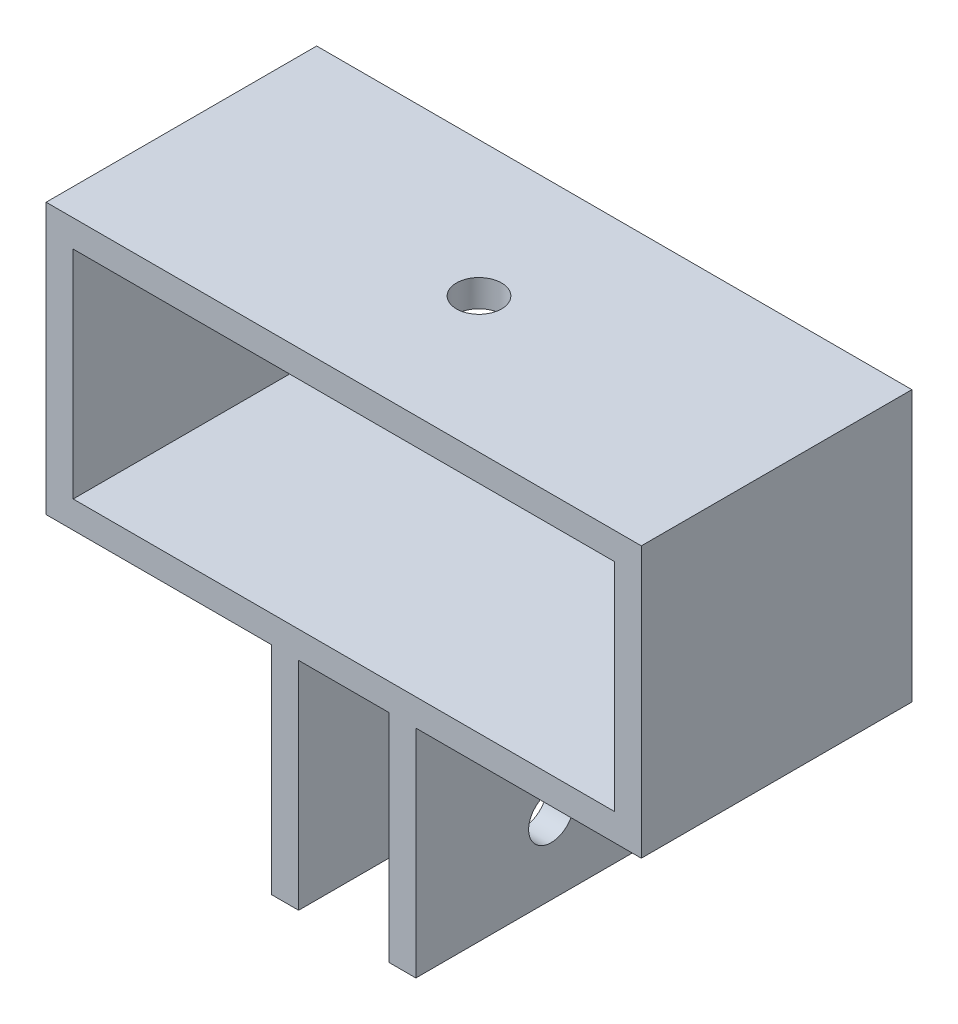
ISO-10303-21;
HEADER;
FILE_DESCRIPTION(('STEP AP214'),'2;1');
FILE_NAME('part.step','',(''),(''),'','','');
FILE_SCHEMA(('AUTOMOTIVE_DESIGN { 1 0 10303 214 1 1 1 1 }'));
ENDSEC;
DATA;
#1=APPLICATION_CONTEXT('core data for automotive mechanical design processes');
#2=APPLICATION_PROTOCOL_DEFINITION('international standard','automotive_design',2000,#1);
#3=PRODUCT_CONTEXT('',#1,'mechanical');
#4=PRODUCT('Part','Part','',(#3));
#5=PRODUCT_RELATED_PRODUCT_CATEGORY('part','',(#4));
#6=PRODUCT_DEFINITION_FORMATION('','',#4);
#7=PRODUCT_DEFINITION_CONTEXT('part definition',#1,'design');
#8=PRODUCT_DEFINITION('design','',#6,#7);
#9=PRODUCT_DEFINITION_SHAPE('','',#8);
#10=(LENGTH_UNIT() NAMED_UNIT(*) SI_UNIT(.MILLI.,.METRE.));
#11=(NAMED_UNIT(*) PLANE_ANGLE_UNIT() SI_UNIT($,.RADIAN.));
#12=(NAMED_UNIT(*) SI_UNIT($,.STERADIAN.) SOLID_ANGLE_UNIT());
#13=UNCERTAINTY_MEASURE_WITH_UNIT(LENGTH_MEASURE(1.E-05),#10,'distance_accuracy_value','');
#14=(GEOMETRIC_REPRESENTATION_CONTEXT(3) GLOBAL_UNCERTAINTY_ASSIGNED_CONTEXT((#13)) GLOBAL_UNIT_ASSIGNED_CONTEXT((#10,
#11,#12)) REPRESENTATION_CONTEXT('',''));
#15=CARTESIAN_POINT('',(0.,0.,0.));
#16=DIRECTION('',(0.,0.,1.));
#17=DIRECTION('',(1.,0.,0.));
#18=AXIS2_PLACEMENT_3D('',#15,#16,#17);
#19=CARTESIAN_POINT('',(-33.,30.,-15.));
#20=DIRECTION('',(0.,0.,1.));
#21=DIRECTION('',(1.,0.,0.));
#22=AXIS2_PLACEMENT_3D('',#19,#20,#21);
#23=PLANE('',#22);
#24=DIRECTION('',(0.,-1.,0.));
#25=VECTOR('',#24,1.);
#26=CARTESIAN_POINT('',(30.,0.,-15.));
#27=LINE('',#26,#25);
#28=CARTESIAN_POINT('',(30.,27.,-15.));
#29=VERTEX_POINT('',#28);
#30=CARTESIAN_POINT('',(30.,3.,-15.));
#31=VERTEX_POINT('',#30);
#32=EDGE_CURVE('E218',#29,#31,#27,.T.);
#33=ORIENTED_EDGE('',*,*,#32,.F.);
#34=DIRECTION('',(1.,0.,0.));
#35=VECTOR('',#34,1.);
#36=CARTESIAN_POINT('',(0.,27.,-15.));
#37=LINE('',#36,#35);
#38=CARTESIAN_POINT('',(-30.,27.,-15.));
#39=VERTEX_POINT('',#38);
#40=EDGE_CURVE('E220',#39,#29,#37,.T.);
#41=ORIENTED_EDGE('',*,*,#40,.F.);
#42=DIRECTION('',(0.,-1.,0.));
#43=VECTOR('',#42,1.);
#44=CARTESIAN_POINT('',(-30.,0.,-15.));
#45=LINE('',#44,#43);
#46=CARTESIAN_POINT('',(-30.,3.,-15.));
#47=VERTEX_POINT('',#46);
#48=EDGE_CURVE('E223',#39,#47,#45,.T.);
#49=ORIENTED_EDGE('',*,*,#48,.T.);
#50=DIRECTION('',(1.,0.,0.));
#51=VECTOR('',#50,1.);
#52=CARTESIAN_POINT('',(0.,3.,-15.));
#53=LINE('',#52,#51);
#54=EDGE_CURVE('E226',#47,#31,#53,.T.);
#55=ORIENTED_EDGE('',*,*,#54,.T.);
#56=EDGE_LOOP('',(#33,#41,#49,#55));
#57=FACE_BOUND('',#56,.T.);
#58=DIRECTION('',(0.,-1.,0.));
#59=VECTOR('',#58,1.);
#60=CARTESIAN_POINT('',(5.,0.,-15.));
#61=LINE('',#60,#59);
#62=CARTESIAN_POINT('',(5.,0.,-15.));
#63=VERTEX_POINT('',#62);
#64=CARTESIAN_POINT('',(5.,-24.,-15.));
#65=VERTEX_POINT('',#64);
#66=EDGE_CURVE('E160',#63,#65,#61,.T.);
#67=ORIENTED_EDGE('',*,*,#66,.F.);
#68=DIRECTION('',(1.,0.,0.));
#69=VECTOR('',#68,1.);
#70=CARTESIAN_POINT('',(-5.,0.,-15.));
#71=LINE('',#70,#69);
#72=CARTESIAN_POINT('',(-5.,0.,-15.));
#73=VERTEX_POINT('',#72);
#74=EDGE_CURVE('E149',#73,#63,#71,.T.);
#75=ORIENTED_EDGE('',*,*,#74,.F.);
#76=DIRECTION('',(0.,-1.,0.));
#77=VECTOR('',#76,1.);
#78=CARTESIAN_POINT('',(-5.,0.,-15.));
#79=LINE('',#78,#77);
#80=CARTESIAN_POINT('',(-5.,-24.,-15.));
#81=VERTEX_POINT('',#80);
#82=EDGE_CURVE('E172',#73,#81,#79,.T.);
#83=ORIENTED_EDGE('',*,*,#82,.T.);
#84=DIRECTION('',(1.,0.,0.));
#85=VECTOR('',#84,1.);
#86=CARTESIAN_POINT('',(-8.,-24.,-15.));
#87=LINE('',#86,#85);
#88=CARTESIAN_POINT('',(-8.,-24.,-15.));
#89=VERTEX_POINT('',#88);
#90=EDGE_CURVE('E196',#89,#81,#87,.T.);
#91=ORIENTED_EDGE('',*,*,#90,.F.);
#92=DIRECTION('',(0.,1.,0.));
#93=VECTOR('',#92,1.);
#94=CARTESIAN_POINT('',(-8.,-24.,-15.));
#95=LINE('',#94,#93);
#96=CARTESIAN_POINT('',(-8.,0.,-15.));
#97=VERTEX_POINT('',#96);
#98=EDGE_CURVE('E205',#89,#97,#95,.T.);
#99=ORIENTED_EDGE('',*,*,#98,.T.);
#100=DIRECTION('',(-1.,0.,0.));
#101=VECTOR('',#100,1.);
#102=CARTESIAN_POINT('',(-33.,0.,-15.));
#103=LINE('',#102,#101);
#104=CARTESIAN_POINT('',(-33.,0.,-15.));
#105=VERTEX_POINT('',#104);
#106=EDGE_CURVE('E263',#97,#105,#103,.T.);
#107=ORIENTED_EDGE('',*,*,#106,.T.);
#108=DIRECTION('',(0.,-1.,0.));
#109=VECTOR('',#108,1.);
#110=CARTESIAN_POINT('',(-33.,30.,-15.));
#111=LINE('',#110,#109);
#112=CARTESIAN_POINT('',(-33.,30.,-15.));
#113=VERTEX_POINT('',#112);
#114=EDGE_CURVE('E43',#113,#105,#111,.T.);
#115=ORIENTED_EDGE('',*,*,#114,.F.);
#116=DIRECTION('',(-1.,0.,0.));
#117=VECTOR('',#116,1.);
#118=CARTESIAN_POINT('',(-33.,30.,-15.));
#119=LINE('',#118,#117);
#120=CARTESIAN_POINT('',(33.,30.,-15.));
#121=VERTEX_POINT('',#120);
#122=EDGE_CURVE('E253',#121,#113,#119,.T.);
#123=ORIENTED_EDGE('',*,*,#122,.F.);
#124=DIRECTION('',(0.,-1.,0.));
#125=VECTOR('',#124,1.);
#126=CARTESIAN_POINT('',(33.,30.,-15.));
#127=LINE('',#126,#125);
#128=CARTESIAN_POINT('',(33.,0.,-15.));
#129=VERTEX_POINT('',#128);
#130=EDGE_CURVE('E11',#121,#129,#127,.T.);
#131=ORIENTED_EDGE('',*,*,#130,.T.);
#132=CARTESIAN_POINT('',(8.,0.,-15.));
#133=VERTEX_POINT('',#132);
#134=EDGE_CURVE('E264',#129,#133,#103,.T.);
#135=ORIENTED_EDGE('',*,*,#134,.T.);
#136=DIRECTION('',(0.,1.,0.));
#137=VECTOR('',#136,1.);
#138=CARTESIAN_POINT('',(8.,-24.,-15.));
#139=LINE('',#138,#137);
#140=CARTESIAN_POINT('',(8.,-24.,-15.));
#141=VERTEX_POINT('',#140);
#142=EDGE_CURVE('E199',#141,#133,#139,.T.);
#143=ORIENTED_EDGE('',*,*,#142,.F.);
#144=EDGE_CURVE('E171',#65,#141,#87,.T.);
#145=ORIENTED_EDGE('',*,*,#144,.F.);
#146=EDGE_LOOP('',(#67,#75,#83,#91,#99,#107,#115,#123,#131,#135,#143,#145));
#147=FACE_BOUND('',#146,.T.);
#148=ADVANCED_FACE('F34',(#57,#147),#23,.F.);
#149=CARTESIAN_POINT('',(-33.,30.,15.));
#150=DIRECTION('',(0.,0.,-1.));
#151=DIRECTION('',(-1.,0.,0.));
#152=AXIS2_PLACEMENT_3D('',#149,#150,#151);
#153=PLANE('',#152);
#154=DIRECTION('',(0.,-1.,0.));
#155=VECTOR('',#154,1.);
#156=CARTESIAN_POINT('',(30.,0.,15.));
#157=LINE('',#156,#155);
#158=CARTESIAN_POINT('',(30.,27.,15.));
#159=VERTEX_POINT('',#158);
#160=CARTESIAN_POINT('',(30.,3.,15.));
#161=VERTEX_POINT('',#160);
#162=EDGE_CURVE('E230',#159,#161,#157,.T.);
#163=ORIENTED_EDGE('',*,*,#162,.T.);
#164=DIRECTION('',(1.,0.,0.));
#165=VECTOR('',#164,1.);
#166=CARTESIAN_POINT('',(0.,3.,15.));
#167=LINE('',#166,#165);
#168=CARTESIAN_POINT('',(-30.,3.,15.));
#169=VERTEX_POINT('',#168);
#170=EDGE_CURVE('E221',#169,#161,#167,.T.);
#171=ORIENTED_EDGE('',*,*,#170,.F.);
#172=DIRECTION('',(0.,-1.,0.));
#173=VECTOR('',#172,1.);
#174=CARTESIAN_POINT('',(-30.,0.,15.));
#175=LINE('',#174,#173);
#176=CARTESIAN_POINT('',(-30.,27.,15.));
#177=VERTEX_POINT('',#176);
#178=EDGE_CURVE('E236',#177,#169,#175,.T.);
#179=ORIENTED_EDGE('',*,*,#178,.F.);
#180=DIRECTION('',(1.,0.,0.));
#181=VECTOR('',#180,1.);
#182=CARTESIAN_POINT('',(0.,27.,15.));
#183=LINE('',#182,#181);
#184=EDGE_CURVE('E233',#177,#159,#183,.T.);
#185=ORIENTED_EDGE('',*,*,#184,.T.);
#186=EDGE_LOOP('',(#163,#171,#179,#185));
#187=FACE_BOUND('',#186,.T.);
#188=DIRECTION('',(0.,-1.,0.));
#189=VECTOR('',#188,1.);
#190=CARTESIAN_POINT('',(5.,0.,15.));
#191=LINE('',#190,#189);
#192=CARTESIAN_POINT('',(5.,0.,15.));
#193=VERTEX_POINT('',#192);
#194=CARTESIAN_POINT('',(5.,-24.,15.));
#195=VERTEX_POINT('',#194);
#196=EDGE_CURVE('E166',#193,#195,#191,.T.);
#197=ORIENTED_EDGE('',*,*,#196,.T.);
#198=DIRECTION('',(-1.,0.,0.));
#199=VECTOR('',#198,1.);
#200=CARTESIAN_POINT('',(-8.,-24.,15.));
#201=LINE('',#200,#199);
#202=CARTESIAN_POINT('',(8.,-24.,15.));
#203=VERTEX_POINT('',#202);
#204=EDGE_CURVE('E191',#203,#195,#201,.T.);
#205=ORIENTED_EDGE('',*,*,#204,.F.);
#206=DIRECTION('',(0.,1.,0.));
#207=VECTOR('',#206,1.);
#208=CARTESIAN_POINT('',(8.,-24.,15.));
#209=LINE('',#208,#207);
#210=CARTESIAN_POINT('',(8.,0.,15.));
#211=VERTEX_POINT('',#210);
#212=EDGE_CURVE('E211',#203,#211,#209,.T.);
#213=ORIENTED_EDGE('',*,*,#212,.T.);
#214=DIRECTION('',(1.,0.,0.));
#215=VECTOR('',#214,1.);
#216=CARTESIAN_POINT('',(-33.,0.,15.));
#217=LINE('',#216,#215);
#218=CARTESIAN_POINT('',(33.,0.,15.));
#219=VERTEX_POINT('',#218);
#220=EDGE_CURVE('E268',#211,#219,#217,.T.);
#221=ORIENTED_EDGE('',*,*,#220,.T.);
#222=DIRECTION('',(0.,-1.,0.));
#223=VECTOR('',#222,1.);
#224=CARTESIAN_POINT('',(33.,30.,15.));
#225=LINE('',#224,#223);
#226=CARTESIAN_POINT('',(33.,30.,15.));
#227=VERTEX_POINT('',#226);
#228=EDGE_CURVE('E260',#227,#219,#225,.T.);
#229=ORIENTED_EDGE('',*,*,#228,.F.);
#230=DIRECTION('',(1.,0.,0.));
#231=VECTOR('',#230,1.);
#232=CARTESIAN_POINT('',(-33.,30.,15.));
#233=LINE('',#232,#231);
#234=CARTESIAN_POINT('',(-33.,30.,15.));
#235=VERTEX_POINT('',#234);
#236=EDGE_CURVE('E258',#235,#227,#233,.T.);
#237=ORIENTED_EDGE('',*,*,#236,.F.);
#238=DIRECTION('',(0.,-1.,0.));
#239=VECTOR('',#238,1.);
#240=CARTESIAN_POINT('',(-33.,30.,15.));
#241=LINE('',#240,#239);
#242=CARTESIAN_POINT('',(-33.,0.,15.));
#243=VERTEX_POINT('',#242);
#244=EDGE_CURVE('E273',#235,#243,#241,.T.);
#245=ORIENTED_EDGE('',*,*,#244,.T.);
#246=CARTESIAN_POINT('',(-8.,0.,15.));
#247=VERTEX_POINT('',#246);
#248=EDGE_CURVE('E254',#243,#247,#217,.T.);
#249=ORIENTED_EDGE('',*,*,#248,.T.);
#250=DIRECTION('',(0.,1.,0.));
#251=VECTOR('',#250,1.);
#252=CARTESIAN_POINT('',(-8.,-24.,15.));
#253=LINE('',#252,#251);
#254=CARTESIAN_POINT('',(-8.,-24.,15.));
#255=VERTEX_POINT('',#254);
#256=EDGE_CURVE('E208',#255,#247,#253,.T.);
#257=ORIENTED_EDGE('',*,*,#256,.F.);
#258=CARTESIAN_POINT('',(-5.,-24.,15.));
#259=VERTEX_POINT('',#258);
#260=EDGE_CURVE('E189',#259,#255,#201,.T.);
#261=ORIENTED_EDGE('',*,*,#260,.F.);
#262=DIRECTION('',(0.,-1.,0.));
#263=VECTOR('',#262,1.);
#264=CARTESIAN_POINT('',(-5.,0.,15.));
#265=LINE('',#264,#263);
#266=CARTESIAN_POINT('',(-5.,0.,15.));
#267=VERTEX_POINT('',#266);
#268=EDGE_CURVE('E51',#267,#259,#265,.T.);
#269=ORIENTED_EDGE('',*,*,#268,.F.);
#270=DIRECTION('',(1.,0.,0.));
#271=VECTOR('',#270,1.);
#272=CARTESIAN_POINT('',(-5.,0.,15.));
#273=LINE('',#272,#271);
#274=EDGE_CURVE('E177',#267,#193,#273,.T.);
#275=ORIENTED_EDGE('',*,*,#274,.T.);
#276=EDGE_LOOP('',(#197,#205,#213,#221,#229,#237,#245,#249,#257,#261,#269,#275));
#277=FACE_BOUND('',#276,.T.);
#278=ADVANCED_FACE('F295',(#187,#277),#153,.F.);
#279=CARTESIAN_POINT('',(0.,-24.,0.));
#280=DIRECTION('',(0.,-1.,0.));
#281=DIRECTION('',(0.,0.,-1.));
#282=AXIS2_PLACEMENT_3D('',#279,#280,#281);
#283=PLANE('',#282);
#284=ORIENTED_EDGE('',*,*,#204,.T.);
#285=DIRECTION('',(0.,0.,1.));
#286=VECTOR('',#285,1.);
#287=CARTESIAN_POINT('',(5.,-24.,-15.));
#288=LINE('',#287,#286);
#289=EDGE_CURVE('E167',#65,#195,#288,.T.);
#290=ORIENTED_EDGE('',*,*,#289,.F.);
#291=ORIENTED_EDGE('',*,*,#144,.T.);
#292=DIRECTION('',(0.,0.,1.));
#293=VECTOR('',#292,1.);
#294=CARTESIAN_POINT('',(8.,-24.,15.));
#295=LINE('',#294,#293);
#296=EDGE_CURVE('E186',#141,#203,#295,.T.);
#297=ORIENTED_EDGE('',*,*,#296,.T.);
#298=EDGE_LOOP('',(#284,#290,#291,#297));
#299=FACE_BOUND('',#298,.T.);
#300=ADVANCED_FACE('F320',(#299),#283,.T.);
#301=CARTESIAN_POINT('',(0.,0.,0.));
#302=DIRECTION('',(0.,1.,0.));
#303=DIRECTION('',(0.,0.,1.));
#304=AXIS2_PLACEMENT_3D('',#301,#302,#303);
#305=PLANE('',#304);
#306=DIRECTION('',(0.,0.,1.));
#307=VECTOR('',#306,1.);
#308=CARTESIAN_POINT('',(8.,0.,15.));
#309=LINE('',#308,#307);
#310=EDGE_CURVE('E59',#133,#211,#309,.T.);
#311=ORIENTED_EDGE('',*,*,#310,.F.);
#312=ORIENTED_EDGE('',*,*,#134,.F.);
#313=DIRECTION('',(0.,0.,-1.));
#314=VECTOR('',#313,1.);
#315=CARTESIAN_POINT('',(33.,0.,-15.));
#316=LINE('',#315,#314);
#317=EDGE_CURVE('E243',#219,#129,#316,.T.);
#318=ORIENTED_EDGE('',*,*,#317,.F.);
#319=ORIENTED_EDGE('',*,*,#220,.F.);
#320=EDGE_LOOP('',(#311,#312,#318,#319));
#321=FACE_BOUND('',#320,.T.);
#322=ADVANCED_FACE('F327',(#321),#305,.F.);
#323=DIRECTION('',(0.,0.,-1.));
#324=VECTOR('',#323,1.);
#325=CARTESIAN_POINT('',(-8.,0.,15.));
#326=LINE('',#325,#324);
#327=EDGE_CURVE('E190',#247,#97,#326,.T.);
#328=ORIENTED_EDGE('',*,*,#327,.F.);
#329=ORIENTED_EDGE('',*,*,#248,.F.);
#330=DIRECTION('',(0.,0.,1.));
#331=VECTOR('',#330,1.);
#332=CARTESIAN_POINT('',(-33.,0.,-15.));
#333=LINE('',#332,#331);
#334=EDGE_CURVE('E266',#105,#243,#333,.T.);
#335=ORIENTED_EDGE('',*,*,#334,.F.);
#336=ORIENTED_EDGE('',*,*,#106,.F.);
#337=EDGE_LOOP('',(#328,#329,#335,#336));
#338=FACE_BOUND('',#337,.T.);
#339=ADVANCED_FACE('F330',(#338),#305,.F.);
#340=CARTESIAN_POINT('',(33.,30.,-15.));
#341=DIRECTION('',(-1.,0.,0.));
#342=DIRECTION('',(0.,0.,1.));
#343=AXIS2_PLACEMENT_3D('',#340,#341,#342);
#344=PLANE('',#343);
#345=ORIENTED_EDGE('',*,*,#317,.T.);
#346=ORIENTED_EDGE('',*,*,#130,.F.);
#347=DIRECTION('',(0.,0.,-1.));
#348=VECTOR('',#347,1.);
#349=CARTESIAN_POINT('',(33.,30.,-15.));
#350=LINE('',#349,#348);
#351=EDGE_CURVE('E250',#227,#121,#350,.T.);
#352=ORIENTED_EDGE('',*,*,#351,.F.);
#353=ORIENTED_EDGE('',*,*,#228,.T.);
#354=EDGE_LOOP('',(#345,#346,#352,#353));
#355=FACE_BOUND('',#354,.T.);
#356=ADVANCED_FACE('F36',(#355),#344,.F.);
#357=CARTESIAN_POINT('',(-33.,30.,-15.));
#358=DIRECTION('',(1.,0.,0.));
#359=DIRECTION('',(0.,0.,-1.));
#360=AXIS2_PLACEMENT_3D('',#357,#358,#359);
#361=PLANE('',#360);
#362=ORIENTED_EDGE('',*,*,#334,.T.);
#363=ORIENTED_EDGE('',*,*,#244,.F.);
#364=DIRECTION('',(0.,0.,1.));
#365=VECTOR('',#364,1.);
#366=CARTESIAN_POINT('',(-33.,30.,-15.));
#367=LINE('',#366,#365);
#368=EDGE_CURVE('E256',#113,#235,#367,.T.);
#369=ORIENTED_EDGE('',*,*,#368,.F.);
#370=ORIENTED_EDGE('',*,*,#114,.T.);
#371=EDGE_LOOP('',(#362,#363,#369,#370));
#372=FACE_BOUND('',#371,.T.);
#373=ADVANCED_FACE('F323',(#372),#361,.F.);
#374=CARTESIAN_POINT('',(0.,30.,0.));
#375=DIRECTION('',(0.,1.,0.));
#376=DIRECTION('',(0.,0.,1.));
#377=AXIS2_PLACEMENT_3D('',#374,#375,#376);
#378=PLANE('',#377);
#379=CARTESIAN_POINT('',(0.,30.,0.));
#380=DIRECTION('',(0.,1.,0.));
#381=DIRECTION('',(0.,0.,1.));
#382=AXIS2_PLACEMENT_3D('',#379,#380,#381);
#383=CIRCLE('',#382,2.5);
#384=CARTESIAN_POINT('',(0.,30.,2.5));
#385=VERTEX_POINT('',#384);
#386=EDGE_CURVE('E214',#385,#385,#383,.T.);
#387=ORIENTED_EDGE('',*,*,#386,.F.);
#388=EDGE_LOOP('',(#387));
#389=FACE_BOUND('',#388,.T.);
#390=ORIENTED_EDGE('',*,*,#351,.T.);
#391=ORIENTED_EDGE('',*,*,#122,.T.);
#392=ORIENTED_EDGE('',*,*,#368,.T.);
#393=ORIENTED_EDGE('',*,*,#236,.T.);
#394=EDGE_LOOP('',(#390,#391,#392,#393));
#395=FACE_BOUND('',#394,.T.);
#396=ADVANCED_FACE('F313',(#389,#395),#378,.T.);
#397=CARTESIAN_POINT('',(30.,0.,-15.));
#398=DIRECTION('',(-1.,0.,0.));
#399=DIRECTION('',(0.,-1.,0.));
#400=AXIS2_PLACEMENT_3D('',#397,#398,#399);
#401=PLANE('',#400);
#402=ORIENTED_EDGE('',*,*,#162,.F.);
#403=DIRECTION('',(0.,0.,1.));
#404=VECTOR('',#403,1.);
#405=CARTESIAN_POINT('',(30.,27.,-15.));
#406=LINE('',#405,#404);
#407=EDGE_CURVE('E229',#29,#159,#406,.T.);
#408=ORIENTED_EDGE('',*,*,#407,.F.);
#409=ORIENTED_EDGE('',*,*,#32,.T.);
#410=DIRECTION('',(0.,0.,1.));
#411=VECTOR('',#410,1.);
#412=CARTESIAN_POINT('',(30.,3.,-15.));
#413=LINE('',#412,#411);
#414=EDGE_CURVE('E241',#31,#161,#413,.T.);
#415=ORIENTED_EDGE('',*,*,#414,.T.);
#416=EDGE_LOOP('',(#402,#408,#409,#415));
#417=FACE_BOUND('',#416,.T.);
#418=ADVANCED_FACE('F302',(#417),#401,.T.);
#419=CARTESIAN_POINT('',(0.,3.,-15.));
#420=DIRECTION('',(0.,-1.,0.));
#421=DIRECTION('',(0.,0.,-1.));
#422=AXIS2_PLACEMENT_3D('',#419,#420,#421);
#423=PLANE('',#422);
#424=ORIENTED_EDGE('',*,*,#170,.T.);
#425=ORIENTED_EDGE('',*,*,#414,.F.);
#426=ORIENTED_EDGE('',*,*,#54,.F.);
#427=DIRECTION('',(0.,0.,1.));
#428=VECTOR('',#427,1.);
#429=CARTESIAN_POINT('',(-30.,3.,-15.));
#430=LINE('',#429,#428);
#431=EDGE_CURVE('E244',#47,#169,#430,.T.);
#432=ORIENTED_EDGE('',*,*,#431,.T.);
#433=EDGE_LOOP('',(#424,#425,#426,#432));
#434=FACE_BOUND('',#433,.T.);
#435=ADVANCED_FACE('F305',(#434),#423,.F.);
#436=CARTESIAN_POINT('',(-30.,0.,-15.));
#437=DIRECTION('',(-1.,0.,0.));
#438=DIRECTION('',(0.,-1.,0.));
#439=AXIS2_PLACEMENT_3D('',#436,#437,#438);
#440=PLANE('',#439);
#441=ORIENTED_EDGE('',*,*,#178,.T.);
#442=ORIENTED_EDGE('',*,*,#431,.F.);
#443=ORIENTED_EDGE('',*,*,#48,.F.);
#444=DIRECTION('',(0.,0.,1.));
#445=VECTOR('',#444,1.);
#446=CARTESIAN_POINT('',(-30.,27.,-15.));
#447=LINE('',#446,#445);
#448=EDGE_CURVE('E246',#39,#177,#447,.T.);
#449=ORIENTED_EDGE('',*,*,#448,.T.);
#450=EDGE_LOOP('',(#441,#442,#443,#449));
#451=FACE_BOUND('',#450,.T.);
#452=ADVANCED_FACE('F286',(#451),#440,.F.);
#453=CARTESIAN_POINT('',(0.,27.,-15.));
#454=DIRECTION('',(0.,-1.,0.));
#455=DIRECTION('',(0.,0.,-1.));
#456=AXIS2_PLACEMENT_3D('',#453,#454,#455);
#457=PLANE('',#456);
#458=CARTESIAN_POINT('',(0.,27.,0.));
#459=DIRECTION('',(0.,-1.,0.));
#460=DIRECTION('',(0.,0.,-1.));
#461=AXIS2_PLACEMENT_3D('',#458,#459,#460);
#462=CIRCLE('',#461,2.5);
#463=CARTESIAN_POINT('',(0.,27.,-2.5));
#464=VERTEX_POINT('',#463);
#465=EDGE_CURVE('E217',#464,#464,#462,.T.);
#466=ORIENTED_EDGE('',*,*,#465,.F.);
#467=EDGE_LOOP('',(#466));
#468=FACE_BOUND('',#467,.T.);
#469=ORIENTED_EDGE('',*,*,#184,.F.);
#470=ORIENTED_EDGE('',*,*,#448,.F.);
#471=ORIENTED_EDGE('',*,*,#40,.T.);
#472=ORIENTED_EDGE('',*,*,#407,.T.);
#473=EDGE_LOOP('',(#469,#470,#471,#472));
#474=FACE_BOUND('',#473,.T.);
#475=ADVANCED_FACE('F283',(#468,#474),#457,.T.);
#476=CARTESIAN_POINT('',(0.,20.,0.));
#477=DIRECTION('',(0.,1.,0.));
#478=DIRECTION('',(0.,0.,1.));
#479=AXIS2_PLACEMENT_3D('',#476,#477,#478);
#480=CYLINDRICAL_SURFACE('',#479,2.5);
#481=ORIENTED_EDGE('',*,*,#465,.T.);
#482=EDGE_LOOP('',(#481));
#483=FACE_BOUND('',#482,.T.);
#484=ORIENTED_EDGE('',*,*,#386,.T.);
#485=EDGE_LOOP('',(#484));
#486=FACE_BOUND('',#485,.T.);
#487=ADVANCED_FACE('F280',(#483,#486),#480,.F.);
#488=CARTESIAN_POINT('',(8.,-24.,15.));
#489=DIRECTION('',(-1.,0.,0.));
#490=DIRECTION('',(0.,0.,1.));
#491=AXIS2_PLACEMENT_3D('',#488,#489,#490);
#492=PLANE('',#491);
#493=CARTESIAN_POINT('',(8.,-16.,0.));
#494=DIRECTION('',(1.,0.,0.));
#495=DIRECTION('',(0.,0.,-1.));
#496=AXIS2_PLACEMENT_3D('',#493,#494,#495);
#497=CIRCLE('',#496,2.5);
#498=CARTESIAN_POINT('',(8.,-16.,-2.5));
#499=VERTEX_POINT('',#498);
#500=EDGE_CURVE('E517',#499,#499,#497,.T.);
#501=ORIENTED_EDGE('',*,*,#500,.F.);
#502=EDGE_LOOP('',(#501));
#503=FACE_BOUND('',#502,.T.);
#504=ORIENTED_EDGE('',*,*,#310,.T.);
#505=ORIENTED_EDGE('',*,*,#212,.F.);
#506=ORIENTED_EDGE('',*,*,#296,.F.);
#507=ORIENTED_EDGE('',*,*,#142,.T.);
#508=EDGE_LOOP('',(#504,#505,#506,#507));
#509=FACE_BOUND('',#508,.T.);
#510=ADVANCED_FACE('F351',(#503,#509),#492,.F.);
#511=CARTESIAN_POINT('',(-8.,-24.,15.));
#512=DIRECTION('',(1.,0.,0.));
#513=DIRECTION('',(0.,0.,-1.));
#514=AXIS2_PLACEMENT_3D('',#511,#512,#513);
#515=PLANE('',#514);
#516=CARTESIAN_POINT('',(-8.,-16.,0.));
#517=DIRECTION('',(1.,0.,0.));
#518=DIRECTION('',(0.,0.,-1.));
#519=AXIS2_PLACEMENT_3D('',#516,#517,#518);
#520=CIRCLE('',#519,2.5);
#521=CARTESIAN_POINT('',(-8.,-16.,-2.5));
#522=VERTEX_POINT('',#521);
#523=EDGE_CURVE('E179',#522,#522,#520,.T.);
#524=ORIENTED_EDGE('',*,*,#523,.T.);
#525=EDGE_LOOP('',(#524));
#526=FACE_BOUND('',#525,.T.);
#527=ORIENTED_EDGE('',*,*,#327,.T.);
#528=ORIENTED_EDGE('',*,*,#98,.F.);
#529=DIRECTION('',(0.,0.,-1.));
#530=VECTOR('',#529,1.);
#531=CARTESIAN_POINT('',(-8.,-24.,15.));
#532=LINE('',#531,#530);
#533=EDGE_CURVE('E194',#255,#89,#532,.T.);
#534=ORIENTED_EDGE('',*,*,#533,.F.);
#535=ORIENTED_EDGE('',*,*,#256,.T.);
#536=EDGE_LOOP('',(#527,#528,#534,#535));
#537=FACE_BOUND('',#536,.T.);
#538=ADVANCED_FACE('F362',(#526,#537),#515,.F.);
#539=DIRECTION('',(0.,0.,1.));
#540=VECTOR('',#539,1.);
#541=CARTESIAN_POINT('',(-5.,-24.,-15.));
#542=LINE('',#541,#540);
#543=EDGE_CURVE('E183',#81,#259,#542,.T.);
#544=ORIENTED_EDGE('',*,*,#543,.T.);
#545=ORIENTED_EDGE('',*,*,#260,.T.);
#546=ORIENTED_EDGE('',*,*,#533,.T.);
#547=ORIENTED_EDGE('',*,*,#90,.T.);
#548=EDGE_LOOP('',(#544,#545,#546,#547));
#549=FACE_BOUND('',#548,.T.);
#550=ADVANCED_FACE('F357',(#549),#283,.T.);
#551=CARTESIAN_POINT('',(-5.,0.,-15.));
#552=DIRECTION('',(0.,-1.,0.));
#553=DIRECTION('',(1.,0.,0.));
#554=AXIS2_PLACEMENT_3D('',#551,#552,#553);
#555=PLANE('',#554);
#556=ORIENTED_EDGE('',*,*,#274,.F.);
#557=DIRECTION('',(0.,0.,1.));
#558=VECTOR('',#557,1.);
#559=CARTESIAN_POINT('',(-5.,0.,-15.));
#560=LINE('',#559,#558);
#561=EDGE_CURVE('E155',#73,#267,#560,.T.);
#562=ORIENTED_EDGE('',*,*,#561,.F.);
#563=ORIENTED_EDGE('',*,*,#74,.T.);
#564=DIRECTION('',(0.,0.,1.));
#565=VECTOR('',#564,1.);
#566=CARTESIAN_POINT('',(5.,0.,-15.));
#567=LINE('',#566,#565);
#568=EDGE_CURVE('E153',#63,#193,#567,.T.);
#569=ORIENTED_EDGE('',*,*,#568,.T.);
#570=EDGE_LOOP('',(#556,#562,#563,#569));
#571=FACE_BOUND('',#570,.T.);
#572=ADVANCED_FACE('F152',(#571),#555,.T.);
#573=CARTESIAN_POINT('',(5.,0.,-15.));
#574=DIRECTION('',(-1.,0.,0.));
#575=DIRECTION('',(0.,0.,1.));
#576=AXIS2_PLACEMENT_3D('',#573,#574,#575);
#577=PLANE('',#576);
#578=CARTESIAN_POINT('',(5.,-16.,0.));
#579=DIRECTION('',(-1.,0.,0.));
#580=DIRECTION('',(0.,0.,1.));
#581=AXIS2_PLACEMENT_3D('',#578,#579,#580);
#582=CIRCLE('',#581,2.5);
#583=CARTESIAN_POINT('',(5.,-16.,2.5));
#584=VERTEX_POINT('',#583);
#585=EDGE_CURVE('E514',#584,#584,#582,.T.);
#586=ORIENTED_EDGE('',*,*,#585,.F.);
#587=EDGE_LOOP('',(#586));
#588=FACE_BOUND('',#587,.T.);
#589=ORIENTED_EDGE('',*,*,#196,.F.);
#590=ORIENTED_EDGE('',*,*,#568,.F.);
#591=ORIENTED_EDGE('',*,*,#66,.T.);
#592=ORIENTED_EDGE('',*,*,#289,.T.);
#593=EDGE_LOOP('',(#589,#590,#591,#592));
#594=FACE_BOUND('',#593,.T.);
#595=ADVANCED_FACE('F163',(#588,#594),#577,.T.);
#596=CARTESIAN_POINT('',(-5.,0.,-15.));
#597=DIRECTION('',(-1.,0.,0.));
#598=DIRECTION('',(0.,-1.,0.));
#599=AXIS2_PLACEMENT_3D('',#596,#597,#598);
#600=PLANE('',#599);
#601=CARTESIAN_POINT('',(-5.,-16.,0.));
#602=DIRECTION('',(-1.,0.,0.));
#603=DIRECTION('',(0.,-1.,0.));
#604=AXIS2_PLACEMENT_3D('',#601,#602,#603);
#605=CIRCLE('',#604,2.5);
#606=CARTESIAN_POINT('',(-5.,-18.5,0.));
#607=VERTEX_POINT('',#606);
#608=EDGE_CURVE('E38',#607,#607,#605,.T.);
#609=ORIENTED_EDGE('',*,*,#608,.T.);
#610=EDGE_LOOP('',(#609));
#611=FACE_BOUND('',#610,.T.);
#612=ORIENTED_EDGE('',*,*,#268,.T.);
#613=ORIENTED_EDGE('',*,*,#543,.F.);
#614=ORIENTED_EDGE('',*,*,#82,.F.);
#615=ORIENTED_EDGE('',*,*,#561,.T.);
#616=EDGE_LOOP('',(#612,#613,#614,#615));
#617=FACE_BOUND('',#616,.T.);
#618=ADVANCED_FACE('F360',(#611,#617),#600,.F.);
#619=CARTESIAN_POINT('',(-16.,-16.,0.));
#620=DIRECTION('',(1.,0.,0.));
#621=DIRECTION('',(0.,0.,-1.));
#622=AXIS2_PLACEMENT_3D('',#619,#620,#621);
#623=CYLINDRICAL_SURFACE('',#622,2.5);
#624=ORIENTED_EDGE('',*,*,#608,.F.);
#625=EDGE_LOOP('',(#624));
#626=FACE_BOUND('',#625,.T.);
#627=ORIENTED_EDGE('',*,*,#523,.F.);
#628=EDGE_LOOP('',(#627));
#629=FACE_BOUND('',#628,.T.);
#630=ADVANCED_FACE('F488',(#626,#629),#623,.F.);
#631=ORIENTED_EDGE('',*,*,#585,.T.);
#632=EDGE_LOOP('',(#631));
#633=FACE_BOUND('',#632,.T.);
#634=ORIENTED_EDGE('',*,*,#500,.T.);
#635=EDGE_LOOP('',(#634));
#636=FACE_BOUND('',#635,.T.);
#637=ADVANCED_FACE('F498',(#633,#636),#623,.F.);
#638=CLOSED_SHELL('',(#148,#278,#300,#322,#339,#356,#373,#396,#418,#435,#452,#475,#487,#510,
#538,#550,#572,#595,#618,#630,#637));
#639=MANIFOLD_SOLID_BREP('B2',#638);
#640=ADVANCED_BREP_SHAPE_REPRESENTATION('',(#18,#639),#14);
#641=SHAPE_DEFINITION_REPRESENTATION(#9,#640);
ENDSEC;
END-ISO-10303-21;
